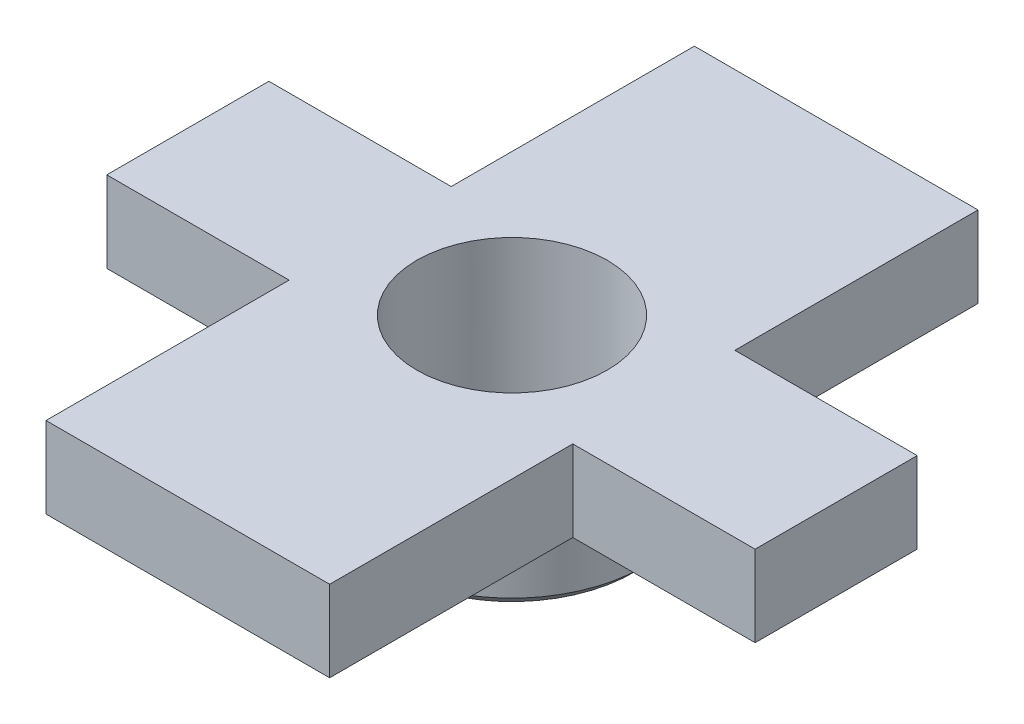
ISO-10303-21;
HEADER;
FILE_DESCRIPTION(('STEP AP214'),'2;1');
FILE_NAME('part.step','',(''),(''),'','','');
FILE_SCHEMA(('AUTOMOTIVE_DESIGN { 1 0 10303 214 1 1 1 1 }'));
ENDSEC;
DATA;
#1=APPLICATION_CONTEXT('core data for automotive mechanical design processes');
#2=APPLICATION_PROTOCOL_DEFINITION('international standard','automotive_design',2000,#1);
#3=PRODUCT_CONTEXT('',#1,'mechanical');
#4=PRODUCT('Part','Part','',(#3));
#5=PRODUCT_RELATED_PRODUCT_CATEGORY('part','',(#4));
#6=PRODUCT_DEFINITION_FORMATION('','',#4);
#7=PRODUCT_DEFINITION_CONTEXT('part definition',#1,'design');
#8=PRODUCT_DEFINITION('design','',#6,#7);
#9=PRODUCT_DEFINITION_SHAPE('','',#8);
#10=(LENGTH_UNIT() NAMED_UNIT(*) SI_UNIT(.MILLI.,.METRE.));
#11=(NAMED_UNIT(*) PLANE_ANGLE_UNIT() SI_UNIT($,.RADIAN.));
#12=(NAMED_UNIT(*) SI_UNIT($,.STERADIAN.) SOLID_ANGLE_UNIT());
#13=UNCERTAINTY_MEASURE_WITH_UNIT(LENGTH_MEASURE(1.E-05),#10,'distance_accuracy_value','');
#14=(GEOMETRIC_REPRESENTATION_CONTEXT(3) GLOBAL_UNCERTAINTY_ASSIGNED_CONTEXT((#13)) GLOBAL_UNIT_ASSIGNED_CONTEXT((#10,
#11,#12)) REPRESENTATION_CONTEXT('',''));
#15=CARTESIAN_POINT('',(0.,0.,0.));
#16=DIRECTION('',(0.,0.,1.));
#17=DIRECTION('',(1.,0.,0.));
#18=AXIS2_PLACEMENT_3D('',#15,#16,#17);
#19=CARTESIAN_POINT('',(8.,2.,2.));
#20=DIRECTION('',(-1.,0.,0.));
#21=DIRECTION('',(0.,0.,1.));
#22=AXIS2_PLACEMENT_3D('',#19,#20,#21);
#23=PLANE('',#22);
#24=DIRECTION('',(0.,0.,-1.));
#25=VECTOR('',#24,1.);
#26=CARTESIAN_POINT('',(8.,0.,2.));
#27=LINE('',#26,#25);
#28=CARTESIAN_POINT('',(8.,0.,2.));
#29=VERTEX_POINT('',#28);
#30=CARTESIAN_POINT('',(8.,0.,-2.));
#31=VERTEX_POINT('',#30);
#32=EDGE_CURVE('E165',#29,#31,#27,.T.);
#33=ORIENTED_EDGE('',*,*,#32,.T.);
#34=DIRECTION('',(0.,-1.,0.));
#35=VECTOR('',#34,1.);
#36=CARTESIAN_POINT('',(8.,2.,-2.));
#37=LINE('',#36,#35);
#38=CARTESIAN_POINT('',(8.,2.,-2.));
#39=VERTEX_POINT('',#38);
#40=EDGE_CURVE('E235',#39,#31,#37,.T.);
#41=ORIENTED_EDGE('',*,*,#40,.F.);
#42=DIRECTION('',(0.,0.,-1.));
#43=VECTOR('',#42,1.);
#44=CARTESIAN_POINT('',(8.,2.,2.));
#45=LINE('',#44,#43);
#46=CARTESIAN_POINT('',(8.,2.,2.));
#47=VERTEX_POINT('',#46);
#48=EDGE_CURVE('E200',#47,#39,#45,.T.);
#49=ORIENTED_EDGE('',*,*,#48,.F.);
#50=DIRECTION('',(0.,-1.,0.));
#51=VECTOR('',#50,1.);
#52=CARTESIAN_POINT('',(8.,2.,2.));
#53=LINE('',#52,#51);
#54=EDGE_CURVE('E161',#47,#29,#53,.T.);
#55=ORIENTED_EDGE('',*,*,#54,.T.);
#56=EDGE_LOOP('',(#33,#41,#49,#55));
#57=FACE_BOUND('',#56,.T.);
#58=ADVANCED_FACE('F38',(#57),#23,.F.);
#59=CARTESIAN_POINT('',(8.,2.,-2.));
#60=DIRECTION('',(0.,0.,1.));
#61=DIRECTION('',(1.,0.,0.));
#62=AXIS2_PLACEMENT_3D('',#59,#60,#61);
#63=PLANE('',#62);
#64=DIRECTION('',(-1.,0.,0.));
#65=VECTOR('',#64,1.);
#66=CARTESIAN_POINT('',(8.,0.,-2.));
#67=LINE('',#66,#65);
#68=CARTESIAN_POINT('',(3.5,0.,-2.));
#69=VERTEX_POINT('',#68);
#70=EDGE_CURVE('E169',#31,#69,#67,.T.);
#71=ORIENTED_EDGE('',*,*,#70,.T.);
#72=DIRECTION('',(0.,-1.,0.));
#73=VECTOR('',#72,1.);
#74=CARTESIAN_POINT('',(3.5,2.,-2.));
#75=LINE('',#74,#73);
#76=CARTESIAN_POINT('',(3.5,2.,-2.));
#77=VERTEX_POINT('',#76);
#78=EDGE_CURVE('E231',#77,#69,#75,.T.);
#79=ORIENTED_EDGE('',*,*,#78,.F.);
#80=DIRECTION('',(-1.,0.,0.));
#81=VECTOR('',#80,1.);
#82=CARTESIAN_POINT('',(8.,2.,-2.));
#83=LINE('',#82,#81);
#84=EDGE_CURVE('E112',#39,#77,#83,.T.);
#85=ORIENTED_EDGE('',*,*,#84,.F.);
#86=ORIENTED_EDGE('',*,*,#40,.T.);
#87=EDGE_LOOP('',(#71,#79,#85,#86));
#88=FACE_BOUND('',#87,.T.);
#89=ADVANCED_FACE('F262',(#88),#63,.F.);
#90=CARTESIAN_POINT('',(3.5,2.,-2.));
#91=DIRECTION('',(-1.,0.,0.));
#92=DIRECTION('',(0.,0.,1.));
#93=AXIS2_PLACEMENT_3D('',#90,#91,#92);
#94=PLANE('',#93);
#95=DIRECTION('',(0.,0.,-1.));
#96=VECTOR('',#95,1.);
#97=CARTESIAN_POINT('',(3.5,0.,-2.));
#98=LINE('',#97,#96);
#99=CARTESIAN_POINT('',(3.5,0.,-8.));
#100=VERTEX_POINT('',#99);
#101=EDGE_CURVE('E173',#69,#100,#98,.T.);
#102=ORIENTED_EDGE('',*,*,#101,.T.);
#103=DIRECTION('',(0.,-1.,0.));
#104=VECTOR('',#103,1.);
#105=CARTESIAN_POINT('',(3.5,2.,-8.));
#106=LINE('',#105,#104);
#107=CARTESIAN_POINT('',(3.5,2.,-8.));
#108=VERTEX_POINT('',#107);
#109=EDGE_CURVE('E227',#108,#100,#106,.T.);
#110=ORIENTED_EDGE('',*,*,#109,.F.);
#111=DIRECTION('',(0.,0.,-1.));
#112=VECTOR('',#111,1.);
#113=CARTESIAN_POINT('',(3.5,2.,-2.));
#114=LINE('',#113,#112);
#115=EDGE_CURVE('E325',#77,#108,#114,.T.);
#116=ORIENTED_EDGE('',*,*,#115,.F.);
#117=ORIENTED_EDGE('',*,*,#78,.T.);
#118=EDGE_LOOP('',(#102,#110,#116,#117));
#119=FACE_BOUND('',#118,.T.);
#120=ADVANCED_FACE('F267',(#119),#94,.F.);
#121=CARTESIAN_POINT('',(-3.5,2.,-8.));
#122=DIRECTION('',(0.,0.,1.));
#123=DIRECTION('',(1.,0.,0.));
#124=AXIS2_PLACEMENT_3D('',#121,#122,#123);
#125=PLANE('',#124);
#126=DIRECTION('',(-1.,0.,0.));
#127=VECTOR('',#126,1.);
#128=CARTESIAN_POINT('',(-3.5,0.,-8.));
#129=LINE('',#128,#127);
#130=CARTESIAN_POINT('',(-3.5,0.,-8.));
#131=VERTEX_POINT('',#130);
#132=EDGE_CURVE('E176',#100,#131,#129,.T.);
#133=ORIENTED_EDGE('',*,*,#132,.T.);
#134=DIRECTION('',(0.,-1.,0.));
#135=VECTOR('',#134,1.);
#136=CARTESIAN_POINT('',(-3.5,2.,-8.));
#137=LINE('',#136,#135);
#138=CARTESIAN_POINT('',(-3.5,2.,-8.));
#139=VERTEX_POINT('',#138);
#140=EDGE_CURVE('E223',#139,#131,#137,.T.);
#141=ORIENTED_EDGE('',*,*,#140,.F.);
#142=DIRECTION('',(-1.,0.,0.));
#143=VECTOR('',#142,1.);
#144=CARTESIAN_POINT('',(-3.5,2.,-8.));
#145=LINE('',#144,#143);
#146=EDGE_CURVE('E332',#108,#139,#145,.T.);
#147=ORIENTED_EDGE('',*,*,#146,.F.);
#148=ORIENTED_EDGE('',*,*,#109,.T.);
#149=EDGE_LOOP('',(#133,#141,#147,#148));
#150=FACE_BOUND('',#149,.T.);
#151=ADVANCED_FACE('F272',(#150),#125,.F.);
#152=CARTESIAN_POINT('',(-3.5,2.,-2.));
#153=DIRECTION('',(1.,0.,0.));
#154=DIRECTION('',(0.,0.,-1.));
#155=AXIS2_PLACEMENT_3D('',#152,#153,#154);
#156=PLANE('',#155);
#157=DIRECTION('',(0.,0.,1.));
#158=VECTOR('',#157,1.);
#159=CARTESIAN_POINT('',(-3.5,0.,-2.));
#160=LINE('',#159,#158);
#161=CARTESIAN_POINT('',(-3.5,0.,-2.));
#162=VERTEX_POINT('',#161);
#163=EDGE_CURVE('E179',#131,#162,#160,.T.);
#164=ORIENTED_EDGE('',*,*,#163,.T.);
#165=DIRECTION('',(0.,-1.,0.));
#166=VECTOR('',#165,1.);
#167=CARTESIAN_POINT('',(-3.5,2.,-2.));
#168=LINE('',#167,#166);
#169=CARTESIAN_POINT('',(-3.5,2.,-2.));
#170=VERTEX_POINT('',#169);
#171=EDGE_CURVE('E219',#170,#162,#168,.T.);
#172=ORIENTED_EDGE('',*,*,#171,.F.);
#173=DIRECTION('',(0.,0.,1.));
#174=VECTOR('',#173,1.);
#175=CARTESIAN_POINT('',(-3.5,2.,-2.));
#176=LINE('',#175,#174);
#177=EDGE_CURVE('E335',#139,#170,#176,.T.);
#178=ORIENTED_EDGE('',*,*,#177,.F.);
#179=ORIENTED_EDGE('',*,*,#140,.T.);
#180=EDGE_LOOP('',(#164,#172,#178,#179));
#181=FACE_BOUND('',#180,.T.);
#182=ADVANCED_FACE('F276',(#181),#156,.F.);
#183=CARTESIAN_POINT('',(-8.,2.,-2.));
#184=DIRECTION('',(0.,0.,1.));
#185=DIRECTION('',(1.,0.,0.));
#186=AXIS2_PLACEMENT_3D('',#183,#184,#185);
#187=PLANE('',#186);
#188=DIRECTION('',(-1.,0.,0.));
#189=VECTOR('',#188,1.);
#190=CARTESIAN_POINT('',(-8.,0.,-2.));
#191=LINE('',#190,#189);
#192=CARTESIAN_POINT('',(-8.,0.,-2.));
#193=VERTEX_POINT('',#192);
#194=EDGE_CURVE('E182',#162,#193,#191,.T.);
#195=ORIENTED_EDGE('',*,*,#194,.T.);
#196=DIRECTION('',(0.,-1.,0.));
#197=VECTOR('',#196,1.);
#198=CARTESIAN_POINT('',(-8.,2.,-2.));
#199=LINE('',#198,#197);
#200=CARTESIAN_POINT('',(-8.,2.,-2.));
#201=VERTEX_POINT('',#200);
#202=EDGE_CURVE('E215',#201,#193,#199,.T.);
#203=ORIENTED_EDGE('',*,*,#202,.F.);
#204=DIRECTION('',(-1.,0.,0.));
#205=VECTOR('',#204,1.);
#206=CARTESIAN_POINT('',(-8.,2.,-2.));
#207=LINE('',#206,#205);
#208=EDGE_CURVE('E338',#170,#201,#207,.T.);
#209=ORIENTED_EDGE('',*,*,#208,.F.);
#210=ORIENTED_EDGE('',*,*,#171,.T.);
#211=EDGE_LOOP('',(#195,#203,#209,#210));
#212=FACE_BOUND('',#211,.T.);
#213=ADVANCED_FACE('F280',(#212),#187,.F.);
#214=CARTESIAN_POINT('',(-8.,2.,2.));
#215=DIRECTION('',(1.,0.,0.));
#216=DIRECTION('',(0.,0.,-1.));
#217=AXIS2_PLACEMENT_3D('',#214,#215,#216);
#218=PLANE('',#217);
#219=DIRECTION('',(0.,0.,1.));
#220=VECTOR('',#219,1.);
#221=CARTESIAN_POINT('',(-8.,0.,2.));
#222=LINE('',#221,#220);
#223=CARTESIAN_POINT('',(-8.,0.,2.));
#224=VERTEX_POINT('',#223);
#225=EDGE_CURVE('E185',#193,#224,#222,.T.);
#226=ORIENTED_EDGE('',*,*,#225,.T.);
#227=DIRECTION('',(0.,-1.,0.));
#228=VECTOR('',#227,1.);
#229=CARTESIAN_POINT('',(-8.,2.,2.));
#230=LINE('',#229,#228);
#231=CARTESIAN_POINT('',(-8.,2.,2.));
#232=VERTEX_POINT('',#231);
#233=EDGE_CURVE('E211',#232,#224,#230,.T.);
#234=ORIENTED_EDGE('',*,*,#233,.F.);
#235=DIRECTION('',(0.,0.,1.));
#236=VECTOR('',#235,1.);
#237=CARTESIAN_POINT('',(-8.,2.,2.));
#238=LINE('',#237,#236);
#239=EDGE_CURVE('E341',#201,#232,#238,.T.);
#240=ORIENTED_EDGE('',*,*,#239,.F.);
#241=ORIENTED_EDGE('',*,*,#202,.T.);
#242=EDGE_LOOP('',(#226,#234,#240,#241));
#243=FACE_BOUND('',#242,.T.);
#244=ADVANCED_FACE('F284',(#243),#218,.F.);
#245=CARTESIAN_POINT('',(-8.,2.,2.));
#246=DIRECTION('',(0.,0.,-1.));
#247=DIRECTION('',(-1.,0.,0.));
#248=AXIS2_PLACEMENT_3D('',#245,#246,#247);
#249=PLANE('',#248);
#250=DIRECTION('',(1.,0.,0.));
#251=VECTOR('',#250,1.);
#252=CARTESIAN_POINT('',(-8.,0.,2.));
#253=LINE('',#252,#251);
#254=CARTESIAN_POINT('',(-3.5,0.,2.));
#255=VERTEX_POINT('',#254);
#256=EDGE_CURVE('E188',#224,#255,#253,.T.);
#257=ORIENTED_EDGE('',*,*,#256,.T.);
#258=DIRECTION('',(0.,-1.,0.));
#259=VECTOR('',#258,1.);
#260=CARTESIAN_POINT('',(-3.5,2.,2.));
#261=LINE('',#260,#259);
#262=CARTESIAN_POINT('',(-3.5,2.,2.));
#263=VERTEX_POINT('',#262);
#264=EDGE_CURVE('E207',#263,#255,#261,.T.);
#265=ORIENTED_EDGE('',*,*,#264,.F.);
#266=DIRECTION('',(1.,0.,0.));
#267=VECTOR('',#266,1.);
#268=CARTESIAN_POINT('',(-8.,2.,2.));
#269=LINE('',#268,#267);
#270=EDGE_CURVE('E344',#232,#263,#269,.T.);
#271=ORIENTED_EDGE('',*,*,#270,.F.);
#272=ORIENTED_EDGE('',*,*,#233,.T.);
#273=EDGE_LOOP('',(#257,#265,#271,#272));
#274=FACE_BOUND('',#273,.T.);
#275=ADVANCED_FACE('F288',(#274),#249,.F.);
#276=CARTESIAN_POINT('',(-3.5,2.,2.));
#277=DIRECTION('',(1.,0.,0.));
#278=DIRECTION('',(0.,0.,-1.));
#279=AXIS2_PLACEMENT_3D('',#276,#277,#278);
#280=PLANE('',#279);
#281=DIRECTION('',(0.,0.,1.));
#282=VECTOR('',#281,1.);
#283=CARTESIAN_POINT('',(-3.5,0.,2.));
#284=LINE('',#283,#282);
#285=CARTESIAN_POINT('',(-3.5,0.,8.));
#286=VERTEX_POINT('',#285);
#287=EDGE_CURVE('E191',#255,#286,#284,.T.);
#288=ORIENTED_EDGE('',*,*,#287,.T.);
#289=DIRECTION('',(0.,-1.,0.));
#290=VECTOR('',#289,1.);
#291=CARTESIAN_POINT('',(-3.5,2.,8.));
#292=LINE('',#291,#290);
#293=CARTESIAN_POINT('',(-3.5,2.,8.));
#294=VERTEX_POINT('',#293);
#295=EDGE_CURVE('E154',#294,#286,#292,.T.);
#296=ORIENTED_EDGE('',*,*,#295,.F.);
#297=DIRECTION('',(0.,0.,1.));
#298=VECTOR('',#297,1.);
#299=CARTESIAN_POINT('',(-3.5,2.,2.));
#300=LINE('',#299,#298);
#301=EDGE_CURVE('E143',#263,#294,#300,.T.);
#302=ORIENTED_EDGE('',*,*,#301,.F.);
#303=ORIENTED_EDGE('',*,*,#264,.T.);
#304=EDGE_LOOP('',(#288,#296,#302,#303));
#305=FACE_BOUND('',#304,.T.);
#306=ADVANCED_FACE('F292',(#305),#280,.F.);
#307=CARTESIAN_POINT('',(-3.5,2.,8.));
#308=DIRECTION('',(0.,0.,-1.));
#309=DIRECTION('',(-1.,0.,0.));
#310=AXIS2_PLACEMENT_3D('',#307,#308,#309);
#311=PLANE('',#310);
#312=DIRECTION('',(1.,0.,0.));
#313=VECTOR('',#312,1.);
#314=CARTESIAN_POINT('',(-3.5,0.,8.));
#315=LINE('',#314,#313);
#316=CARTESIAN_POINT('',(3.5,0.,8.));
#317=VERTEX_POINT('',#316);
#318=EDGE_CURVE('E152',#286,#317,#315,.T.);
#319=ORIENTED_EDGE('',*,*,#318,.T.);
#320=DIRECTION('',(0.,-1.,0.));
#321=VECTOR('',#320,1.);
#322=CARTESIAN_POINT('',(3.5,2.,8.));
#323=LINE('',#322,#321);
#324=CARTESIAN_POINT('',(3.5,2.,8.));
#325=VERTEX_POINT('',#324);
#326=EDGE_CURVE('E149',#325,#317,#323,.T.);
#327=ORIENTED_EDGE('',*,*,#326,.F.);
#328=DIRECTION('',(1.,0.,0.));
#329=VECTOR('',#328,1.);
#330=CARTESIAN_POINT('',(-3.5,2.,8.));
#331=LINE('',#330,#329);
#332=EDGE_CURVE('E137',#294,#325,#331,.T.);
#333=ORIENTED_EDGE('',*,*,#332,.F.);
#334=ORIENTED_EDGE('',*,*,#295,.T.);
#335=EDGE_LOOP('',(#319,#327,#333,#334));
#336=FACE_BOUND('',#335,.T.);
#337=ADVANCED_FACE('F150',(#336),#311,.F.);
#338=CARTESIAN_POINT('',(3.5,2.,2.));
#339=DIRECTION('',(-1.,0.,0.));
#340=DIRECTION('',(0.,0.,1.));
#341=AXIS2_PLACEMENT_3D('',#338,#339,#340);
#342=PLANE('',#341);
#343=DIRECTION('',(0.,0.,-1.));
#344=VECTOR('',#343,1.);
#345=CARTESIAN_POINT('',(3.5,0.,2.));
#346=LINE('',#345,#344);
#347=CARTESIAN_POINT('',(3.5,0.,2.));
#348=VERTEX_POINT('',#347);
#349=EDGE_CURVE('E97',#317,#348,#346,.T.);
#350=ORIENTED_EDGE('',*,*,#349,.T.);
#351=DIRECTION('',(0.,-1.,0.));
#352=VECTOR('',#351,1.);
#353=CARTESIAN_POINT('',(3.5,2.,2.));
#354=LINE('',#353,#352);
#355=CARTESIAN_POINT('',(3.5,2.,2.));
#356=VERTEX_POINT('',#355);
#357=EDGE_CURVE('E155',#356,#348,#354,.T.);
#358=ORIENTED_EDGE('',*,*,#357,.F.);
#359=DIRECTION('',(0.,0.,-1.));
#360=VECTOR('',#359,1.);
#361=CARTESIAN_POINT('',(3.5,2.,2.));
#362=LINE('',#361,#360);
#363=EDGE_CURVE('E141',#325,#356,#362,.T.);
#364=ORIENTED_EDGE('',*,*,#363,.F.);
#365=ORIENTED_EDGE('',*,*,#326,.T.);
#366=EDGE_LOOP('',(#350,#358,#364,#365));
#367=FACE_BOUND('',#366,.T.);
#368=ADVANCED_FACE('F157',(#367),#342,.F.);
#369=CARTESIAN_POINT('',(8.,2.,2.));
#370=DIRECTION('',(0.,0.,-1.));
#371=DIRECTION('',(-1.,0.,0.));
#372=AXIS2_PLACEMENT_3D('',#369,#370,#371);
#373=PLANE('',#372);
#374=DIRECTION('',(1.,0.,0.));
#375=VECTOR('',#374,1.);
#376=CARTESIAN_POINT('',(8.,0.,2.));
#377=LINE('',#376,#375);
#378=EDGE_CURVE('E103',#348,#29,#377,.T.);
#379=ORIENTED_EDGE('',*,*,#378,.T.);
#380=ORIENTED_EDGE('',*,*,#54,.F.);
#381=DIRECTION('',(1.,0.,0.));
#382=VECTOR('',#381,1.);
#383=CARTESIAN_POINT('',(8.,2.,2.));
#384=LINE('',#383,#382);
#385=EDGE_CURVE('E56',#356,#47,#384,.T.);
#386=ORIENTED_EDGE('',*,*,#385,.F.);
#387=ORIENTED_EDGE('',*,*,#357,.T.);
#388=EDGE_LOOP('',(#379,#380,#386,#387));
#389=FACE_BOUND('',#388,.T.);
#390=ADVANCED_FACE('F301',(#389),#373,.F.);
#391=CARTESIAN_POINT('',(0.,2.,0.));
#392=DIRECTION('',(0.,1.,0.));
#393=DIRECTION('',(0.,0.,1.));
#394=AXIS2_PLACEMENT_3D('',#391,#392,#393);
#395=PLANE('',#394);
#396=CARTESIAN_POINT('',(0.,2.,0.));
#397=DIRECTION('',(0.,1.,0.));
#398=DIRECTION('',(0.,0.,1.));
#399=AXIS2_PLACEMENT_3D('',#396,#397,#398);
#400=CIRCLE('',#399,2.35);
#401=CARTESIAN_POINT('',(0.,2.,2.35));
#402=VERTEX_POINT('',#401);
#403=EDGE_CURVE('E170',#402,#402,#400,.F.);
#404=ORIENTED_EDGE('',*,*,#403,.T.);
#405=EDGE_LOOP('',(#404));
#406=FACE_BOUND('',#405,.T.);
#407=ORIENTED_EDGE('',*,*,#48,.T.);
#408=ORIENTED_EDGE('',*,*,#84,.T.);
#409=ORIENTED_EDGE('',*,*,#115,.T.);
#410=ORIENTED_EDGE('',*,*,#146,.T.);
#411=ORIENTED_EDGE('',*,*,#177,.T.);
#412=ORIENTED_EDGE('',*,*,#208,.T.);
#413=ORIENTED_EDGE('',*,*,#239,.T.);
#414=ORIENTED_EDGE('',*,*,#270,.T.);
#415=ORIENTED_EDGE('',*,*,#301,.T.);
#416=ORIENTED_EDGE('',*,*,#332,.T.);
#417=ORIENTED_EDGE('',*,*,#363,.T.);
#418=ORIENTED_EDGE('',*,*,#385,.T.);
#419=EDGE_LOOP('',(#407,#408,#409,#410,#411,#412,#413,#414,#415,#416,#417,#418));
#420=FACE_BOUND('',#419,.T.);
#421=ADVANCED_FACE('F139',(#406,#420),#395,.T.);
#422=CARTESIAN_POINT('',(0.,0.,0.));
#423=DIRECTION('',(0.,1.,0.));
#424=DIRECTION('',(0.,0.,1.));
#425=AXIS2_PLACEMENT_3D('',#422,#423,#424);
#426=PLANE('',#425);
#427=CARTESIAN_POINT('',(0.,0.,0.));
#428=DIRECTION('',(0.,1.,0.));
#429=DIRECTION('',(0.,0.,1.));
#430=AXIS2_PLACEMENT_3D('',#427,#428,#429);
#431=CIRCLE('',#430,3.25);
#432=CARTESIAN_POINT('',(0.,0.,3.25));
#433=VERTEX_POINT('',#432);
#434=EDGE_CURVE('E238',#433,#433,#431,.F.);
#435=ORIENTED_EDGE('',*,*,#434,.F.);
#436=EDGE_LOOP('',(#435));
#437=FACE_BOUND('',#436,.T.);
#438=ORIENTED_EDGE('',*,*,#32,.F.);
#439=ORIENTED_EDGE('',*,*,#378,.F.);
#440=ORIENTED_EDGE('',*,*,#349,.F.);
#441=ORIENTED_EDGE('',*,*,#318,.F.);
#442=ORIENTED_EDGE('',*,*,#287,.F.);
#443=ORIENTED_EDGE('',*,*,#256,.F.);
#444=ORIENTED_EDGE('',*,*,#225,.F.);
#445=ORIENTED_EDGE('',*,*,#194,.F.);
#446=ORIENTED_EDGE('',*,*,#163,.F.);
#447=ORIENTED_EDGE('',*,*,#132,.F.);
#448=ORIENTED_EDGE('',*,*,#101,.F.);
#449=ORIENTED_EDGE('',*,*,#70,.F.);
#450=EDGE_LOOP('',(#438,#439,#440,#441,#442,#443,#444,#445,#446,#447,#448,#449));
#451=FACE_BOUND('',#450,.T.);
#452=ADVANCED_FACE('F304',(#437,#451),#426,.F.);
#453=CARTESIAN_POINT('',(0.,-2.,0.));
#454=DIRECTION('',(0.,1.,0.));
#455=DIRECTION('',(0.,0.,1.));
#456=AXIS2_PLACEMENT_3D('',#453,#454,#455);
#457=CYLINDRICAL_SURFACE('',#456,3.25);
#458=CARTESIAN_POINT('',(0.,-1.75,0.));
#459=DIRECTION('',(0.,-1.,0.));
#460=DIRECTION('',(0.,0.,-1.));
#461=AXIS2_PLACEMENT_3D('',#458,#459,#460);
#462=CIRCLE('',#461,3.25);
#463=CARTESIAN_POINT('',(0.,-1.75,-3.25));
#464=VERTEX_POINT('',#463);
#465=EDGE_CURVE('E11',#464,#464,#462,.F.);
#466=ORIENTED_EDGE('',*,*,#465,.T.);
#467=EDGE_LOOP('',(#466));
#468=FACE_BOUND('',#467,.T.);
#469=ORIENTED_EDGE('',*,*,#434,.T.);
#470=EDGE_LOOP('',(#469));
#471=FACE_BOUND('',#470,.T.);
#472=ADVANCED_FACE('F257',(#468,#471),#457,.T.);
#473=CARTESIAN_POINT('',(0.,-2.,0.));
#474=DIRECTION('',(0.,-1.,0.));
#475=DIRECTION('',(0.,0.,-1.));
#476=AXIS2_PLACEMENT_3D('',#473,#474,#475);
#477=PLANE('',#476);
#478=CARTESIAN_POINT('',(0.,-2.,0.));
#479=DIRECTION('',(0.,-1.,0.));
#480=DIRECTION('',(0.,0.,-1.));
#481=AXIS2_PLACEMENT_3D('',#478,#479,#480);
#482=CIRCLE('',#481,2.35);
#483=CARTESIAN_POINT('',(0.,-2.,-2.35));
#484=VERTEX_POINT('',#483);
#485=EDGE_CURVE('E367',#484,#484,#482,.T.);
#486=ORIENTED_EDGE('',*,*,#485,.F.);
#487=EDGE_LOOP('',(#486));
#488=FACE_BOUND('',#487,.T.);
#489=CARTESIAN_POINT('',(0.,-2.,0.));
#490=DIRECTION('',(0.,-1.,0.));
#491=DIRECTION('',(0.,0.,-1.));
#492=AXIS2_PLACEMENT_3D('',#489,#490,#491);
#493=CIRCLE('',#492,3.);
#494=CARTESIAN_POINT('',(0.,-2.,-3.));
#495=VERTEX_POINT('',#494);
#496=EDGE_CURVE('E48',#495,#495,#493,.T.);
#497=ORIENTED_EDGE('',*,*,#496,.T.);
#498=EDGE_LOOP('',(#497));
#499=FACE_BOUND('',#498,.T.);
#500=ADVANCED_FACE('F245',(#488,#499),#477,.T.);
#501=CARTESIAN_POINT('',(0.,-2.,0.));
#502=DIRECTION('',(0.,1.,0.));
#503=DIRECTION('',(0.,0.,1.));
#504=AXIS2_PLACEMENT_3D('',#501,#502,#503);
#505=CONICAL_SURFACE('',#504,3.,0.785398163397447);
#506=ORIENTED_EDGE('',*,*,#465,.F.);
#507=EDGE_LOOP('',(#506));
#508=FACE_BOUND('',#507,.T.);
#509=ORIENTED_EDGE('',*,*,#496,.F.);
#510=EDGE_LOOP('',(#509));
#511=FACE_BOUND('',#510,.T.);
#512=ADVANCED_FACE('F40',(#508,#511),#505,.T.);
#513=CARTESIAN_POINT('',(0.,8.64680374315355,0.));
#514=DIRECTION('',(0.,-1.,0.));
#515=DIRECTION('',(0.,0.,-1.));
#516=AXIS2_PLACEMENT_3D('',#513,#514,#515);
#517=CYLINDRICAL_SURFACE('',#516,2.35);
#518=ORIENTED_EDGE('',*,*,#485,.T.);
#519=EDGE_LOOP('',(#518));
#520=FACE_BOUND('',#519,.T.);
#521=ORIENTED_EDGE('',*,*,#403,.F.);
#522=EDGE_LOOP('',(#521));
#523=FACE_BOUND('',#522,.T.);
#524=ADVANCED_FACE('F248',(#520,#523),#517,.F.);
#525=CLOSED_SHELL('',(#58,#89,#120,#151,#182,#213,#244,#275,#306,#337,#368,#390,#421,#452,#472,
#500,#512,#524));
#526=MANIFOLD_SOLID_BREP('B2',#525);
#527=ADVANCED_BREP_SHAPE_REPRESENTATION('',(#18,#526),#14);
#528=SHAPE_DEFINITION_REPRESENTATION(#9,#527);
ENDSEC;
END-ISO-10303-21;
